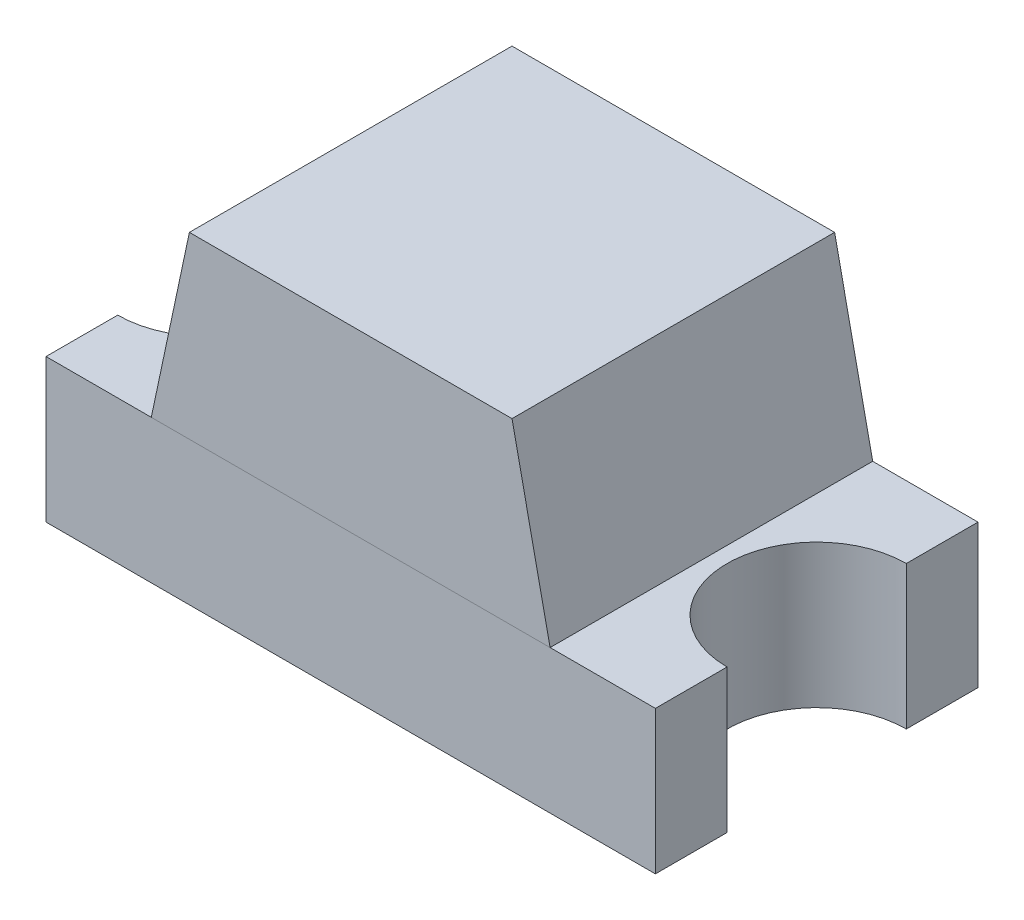
ISO-10303-21;
HEADER;
FILE_DESCRIPTION(('STEP AP214'),'2;1');
FILE_NAME('part.step','',(''),(''),'','','');
FILE_SCHEMA(('AUTOMOTIVE_DESIGN { 1 0 10303 214 1 1 1 1 }'));
ENDSEC;
DATA;
#1=APPLICATION_CONTEXT('core data for automotive mechanical design processes');
#2=APPLICATION_PROTOCOL_DEFINITION('international standard','automotive_design',2000,#1);
#3=PRODUCT_CONTEXT('',#1,'mechanical');
#4=PRODUCT('Part','Part','',(#3));
#5=PRODUCT_RELATED_PRODUCT_CATEGORY('part','',(#4));
#6=PRODUCT_DEFINITION_FORMATION('','',#4);
#7=PRODUCT_DEFINITION_CONTEXT('part definition',#1,'design');
#8=PRODUCT_DEFINITION('design','',#6,#7);
#9=PRODUCT_DEFINITION_SHAPE('','',#8);
#10=(LENGTH_UNIT() NAMED_UNIT(*) SI_UNIT(.MILLI.,.METRE.));
#11=(NAMED_UNIT(*) PLANE_ANGLE_UNIT() SI_UNIT($,.RADIAN.));
#12=(NAMED_UNIT(*) SI_UNIT($,.STERADIAN.) SOLID_ANGLE_UNIT());
#13=UNCERTAINTY_MEASURE_WITH_UNIT(LENGTH_MEASURE(1.E-05),#10,'distance_accuracy_value','');
#14=(GEOMETRIC_REPRESENTATION_CONTEXT(3) GLOBAL_UNCERTAINTY_ASSIGNED_CONTEXT((#13)) GLOBAL_UNIT_ASSIGNED_CONTEXT((#10,
#11,#12)) REPRESENTATION_CONTEXT('',''));
#15=CARTESIAN_POINT('',(0.,0.,0.));
#16=DIRECTION('',(0.,0.,1.));
#17=DIRECTION('',(1.,0.,0.));
#18=AXIS2_PLACEMENT_3D('',#15,#16,#17);
#19=CARTESIAN_POINT('',(-0.45,0.9,0.45));
#20=DIRECTION('',(-0.978147600733806,0.20791169081776,0.));
#21=DIRECTION('',(-0.20791169081776,-0.978147600733806,0.));
#22=AXIS2_PLACEMENT_3D('',#19,#20,#21);
#23=PLANE('',#22);
#24=DIRECTION('',(0.,0.,-1.));
#25=VECTOR('',#24,1.);
#26=CARTESIAN_POINT('',(-0.556278280835011,0.4,-0.45));
#27=LINE('',#26,#25);
#28=CARTESIAN_POINT('',(-0.556278280835011,0.4,-0.45));
#29=VERTEX_POINT('',#28);
#30=CARTESIAN_POINT('',(-0.556278280835011,0.4,0.45));
#31=VERTEX_POINT('',#30);
#32=EDGE_CURVE('E97',#29,#31,#27,.F.);
#33=ORIENTED_EDGE('',*,*,#32,.T.);
#34=DIRECTION('',(0.20791169081776,0.978147600733806,0.));
#35=VECTOR('',#34,1.);
#36=CARTESIAN_POINT('',(-0.45,0.9,0.45));
#37=LINE('',#36,#35);
#38=CARTESIAN_POINT('',(-0.45,0.9,0.45));
#39=VERTEX_POINT('',#38);
#40=EDGE_CURVE('E12',#39,#31,#37,.F.);
#41=ORIENTED_EDGE('',*,*,#40,.F.);
#42=DIRECTION('',(0.,0.,1.));
#43=VECTOR('',#42,1.);
#44=CARTESIAN_POINT('',(-0.45,0.9,0.45));
#45=LINE('',#44,#43);
#46=CARTESIAN_POINT('',(-0.45,0.9,-0.45));
#47=VERTEX_POINT('',#46);
#48=EDGE_CURVE('E98',#47,#39,#45,.T.);
#49=ORIENTED_EDGE('',*,*,#48,.F.);
#50=DIRECTION('',(0.20791169081776,0.978147600733806,0.));
#51=VECTOR('',#50,1.);
#52=CARTESIAN_POINT('',(-0.45,0.9,-0.45));
#53=LINE('',#52,#51);
#54=EDGE_CURVE('E93',#47,#29,#53,.F.);
#55=ORIENTED_EDGE('',*,*,#54,.T.);
#56=EDGE_LOOP('',(#33,#41,#49,#55));
#57=FACE_BOUND('',#56,.T.);
#58=ADVANCED_FACE('F42',(#57),#23,.T.);
#59=CARTESIAN_POINT('',(-0.45,0.9,0.45));
#60=DIRECTION('',(0.,0.,-1.));
#61=DIRECTION('',(-1.,0.,0.));
#62=AXIS2_PLACEMENT_3D('',#59,#60,#61);
#63=PLANE('',#62);
#64=DIRECTION('',(1.,0.,0.));
#65=VECTOR('',#64,1.);
#66=CARTESIAN_POINT('',(-0.45,0.4,0.45));
#67=LINE('',#66,#65);
#68=CARTESIAN_POINT('',(0.556278280835011,0.4,0.45));
#69=VERTEX_POINT('',#68);
#70=EDGE_CURVE('E77',#31,#69,#67,.T.);
#71=ORIENTED_EDGE('',*,*,#70,.T.);
#72=DIRECTION('',(-0.20791169081776,0.978147600733806,0.));
#73=VECTOR('',#72,1.);
#74=CARTESIAN_POINT('',(0.45,0.9,0.45));
#75=LINE('',#74,#73);
#76=CARTESIAN_POINT('',(0.45,0.9,0.45));
#77=VERTEX_POINT('',#76);
#78=EDGE_CURVE('E52',#77,#69,#75,.F.);
#79=ORIENTED_EDGE('',*,*,#78,.F.);
#80=DIRECTION('',(1.,0.,0.));
#81=VECTOR('',#80,1.);
#82=CARTESIAN_POINT('',(-0.45,0.9,0.45));
#83=LINE('',#82,#81);
#84=EDGE_CURVE('E100',#39,#77,#83,.T.);
#85=ORIENTED_EDGE('',*,*,#84,.F.);
#86=ORIENTED_EDGE('',*,*,#40,.T.);
#87=EDGE_LOOP('',(#71,#79,#85,#86));
#88=FACE_BOUND('',#87,.T.);
#89=ADVANCED_FACE('F115',(#88),#63,.F.);
#90=CARTESIAN_POINT('',(0.45,0.9,0.45));
#91=DIRECTION('',(0.978147600733806,0.20791169081776,0.));
#92=DIRECTION('',(-0.20791169081776,0.978147600733806,0.));
#93=AXIS2_PLACEMENT_3D('',#90,#91,#92);
#94=PLANE('',#93);
#95=DIRECTION('',(0.,0.,1.));
#96=VECTOR('',#95,1.);
#97=CARTESIAN_POINT('',(0.556278280835011,0.4,-0.45));
#98=LINE('',#97,#96);
#99=CARTESIAN_POINT('',(0.556278280835011,0.4,-0.45));
#100=VERTEX_POINT('',#99);
#101=EDGE_CURVE('E83',#69,#100,#98,.F.);
#102=ORIENTED_EDGE('',*,*,#101,.T.);
#103=DIRECTION('',(-0.20791169081776,0.978147600733806,0.));
#104=VECTOR('',#103,1.);
#105=CARTESIAN_POINT('',(0.41109545593917,1.08303148938411,-0.45));
#106=LINE('',#105,#104);
#107=CARTESIAN_POINT('',(0.45,0.9,-0.45));
#108=VERTEX_POINT('',#107);
#109=EDGE_CURVE('E46',#108,#100,#106,.F.);
#110=ORIENTED_EDGE('',*,*,#109,.F.);
#111=DIRECTION('',(0.,0.,-1.));
#112=VECTOR('',#111,1.);
#113=CARTESIAN_POINT('',(0.45,0.9,0.45));
#114=LINE('',#113,#112);
#115=EDGE_CURVE('E108',#77,#108,#114,.T.);
#116=ORIENTED_EDGE('',*,*,#115,.F.);
#117=ORIENTED_EDGE('',*,*,#78,.T.);
#118=EDGE_LOOP('',(#102,#110,#116,#117));
#119=FACE_BOUND('',#118,.T.);
#120=ADVANCED_FACE('F44',(#119),#94,.T.);
#121=CARTESIAN_POINT('',(-0.45,0.9,-0.45));
#122=DIRECTION('',(0.,0.,1.));
#123=DIRECTION('',(1.,0.,0.));
#124=AXIS2_PLACEMENT_3D('',#121,#122,#123);
#125=PLANE('',#124);
#126=DIRECTION('',(-1.,0.,0.));
#127=VECTOR('',#126,1.);
#128=CARTESIAN_POINT('',(-0.45,0.4,-0.45));
#129=LINE('',#128,#127);
#130=EDGE_CURVE('E88',#100,#29,#129,.T.);
#131=ORIENTED_EDGE('',*,*,#130,.T.);
#132=ORIENTED_EDGE('',*,*,#54,.F.);
#133=DIRECTION('',(-1.,0.,0.));
#134=VECTOR('',#133,1.);
#135=CARTESIAN_POINT('',(-0.45,0.9,-0.45));
#136=LINE('',#135,#134);
#137=EDGE_CURVE('E61',#108,#47,#136,.T.);
#138=ORIENTED_EDGE('',*,*,#137,.F.);
#139=ORIENTED_EDGE('',*,*,#109,.T.);
#140=EDGE_LOOP('',(#131,#132,#138,#139));
#141=FACE_BOUND('',#140,.T.);
#142=ADVANCED_FACE('F91',(#141),#125,.F.);
#143=CARTESIAN_POINT('',(-0.45,0.9,-0.45));
#144=DIRECTION('',(0.,-1.,0.));
#145=DIRECTION('',(0.,0.,-1.));
#146=AXIS2_PLACEMENT_3D('',#143,#144,#145);
#147=PLANE('',#146);
#148=ORIENTED_EDGE('',*,*,#48,.T.);
#149=ORIENTED_EDGE('',*,*,#84,.T.);
#150=ORIENTED_EDGE('',*,*,#115,.T.);
#151=ORIENTED_EDGE('',*,*,#137,.T.);
#152=EDGE_LOOP('',(#148,#149,#150,#151));
#153=FACE_BOUND('',#152,.T.);
#154=ADVANCED_FACE('F113',(#153),#147,.F.);
#155=CARTESIAN_POINT('',(-0.45,0.4,-0.45));
#156=DIRECTION('',(0.,-1.,0.));
#157=DIRECTION('',(0.,0.,-1.));
#158=AXIS2_PLACEMENT_3D('',#155,#156,#157);
#159=PLANE('',#158);
#160=ORIENTED_EDGE('',*,*,#32,.F.);
#161=ORIENTED_EDGE('',*,*,#130,.F.);
#162=ORIENTED_EDGE('',*,*,#101,.F.);
#163=ORIENTED_EDGE('',*,*,#70,.F.);
#164=EDGE_LOOP('',(#160,#161,#162,#163));
#165=FACE_BOUND('',#164,.T.);
#166=ADVANCED_FACE('F95',(#165),#159,.T.);
#167=CLOSED_SHELL('',(#58,#89,#120,#142,#154,#166));
#168=MANIFOLD_SOLID_BREP('B2',#167);
#169=CARTESIAN_POINT('',(0.85,0.4,0.));
#170=DIRECTION('',(0.,-1.,0.));
#171=DIRECTION('',(0.,0.,-1.));
#172=AXIS2_PLACEMENT_3D('',#169,#170,#171);
#173=CYLINDRICAL_SURFACE('',#172,0.25);
#174=CARTESIAN_POINT('',(0.85,0.,0.));
#175=DIRECTION('',(0.,-1.,0.));
#176=DIRECTION('',(0.,0.,1.));
#177=AXIS2_PLACEMENT_3D('',#174,#175,#176);
#178=CIRCLE('',#177,0.25);
#179=CARTESIAN_POINT('',(0.85,0.,0.25));
#180=VERTEX_POINT('',#179);
#181=CARTESIAN_POINT('',(0.85,0.,-0.25));
#182=VERTEX_POINT('',#181);
#183=EDGE_CURVE('E261',#180,#182,#178,.T.);
#184=ORIENTED_EDGE('',*,*,#183,.T.);
#185=DIRECTION('',(0.,-1.,0.));
#186=VECTOR('',#185,1.);
#187=CARTESIAN_POINT('',(0.85,0.4,-0.25));
#188=LINE('',#187,#186);
#189=CARTESIAN_POINT('',(0.85,0.4,-0.25));
#190=VERTEX_POINT('',#189);
#191=EDGE_CURVE('E40',#190,#182,#188,.T.);
#192=ORIENTED_EDGE('',*,*,#191,.F.);
#193=CARTESIAN_POINT('',(0.85,0.4,0.));
#194=DIRECTION('',(0.,-1.,0.));
#195=DIRECTION('',(0.,0.,1.));
#196=AXIS2_PLACEMENT_3D('',#193,#194,#195);
#197=CIRCLE('',#196,0.25);
#198=CARTESIAN_POINT('',(0.85,0.4,0.25));
#199=VERTEX_POINT('',#198);
#200=EDGE_CURVE('E275',#199,#190,#197,.T.);
#201=ORIENTED_EDGE('',*,*,#200,.F.);
#202=DIRECTION('',(0.,-1.,0.));
#203=VECTOR('',#202,1.);
#204=CARTESIAN_POINT('',(0.85,0.4,0.25));
#205=LINE('',#204,#203);
#206=EDGE_CURVE('E257',#199,#180,#205,.T.);
#207=ORIENTED_EDGE('',*,*,#206,.T.);
#208=EDGE_LOOP('',(#184,#192,#201,#207));
#209=FACE_BOUND('',#208,.T.);
#210=ADVANCED_FACE('F165',(#209),#173,.F.);
#211=CARTESIAN_POINT('',(0.85,0.4,-0.25));
#212=DIRECTION('',(-1.,0.,0.));
#213=DIRECTION('',(0.,0.,1.));
#214=AXIS2_PLACEMENT_3D('',#211,#212,#213);
#215=PLANE('',#214);
#216=DIRECTION('',(0.,0.,-1.));
#217=VECTOR('',#216,1.);
#218=CARTESIAN_POINT('',(0.85,0.,-0.25));
#219=LINE('',#218,#217);
#220=CARTESIAN_POINT('',(0.85,0.,-0.45));
#221=VERTEX_POINT('',#220);
#222=EDGE_CURVE('E264',#182,#221,#219,.T.);
#223=ORIENTED_EDGE('',*,*,#222,.T.);
#224=DIRECTION('',(0.,-1.,0.));
#225=VECTOR('',#224,1.);
#226=CARTESIAN_POINT('',(0.85,0.4,-0.45));
#227=LINE('',#226,#225);
#228=CARTESIAN_POINT('',(0.85,0.4,-0.45));
#229=VERTEX_POINT('',#228);
#230=EDGE_CURVE('E173',#229,#221,#227,.T.);
#231=ORIENTED_EDGE('',*,*,#230,.F.);
#232=DIRECTION('',(0.,0.,-1.));
#233=VECTOR('',#232,1.);
#234=CARTESIAN_POINT('',(0.85,0.4,-0.25));
#235=LINE('',#234,#233);
#236=EDGE_CURVE('E224',#190,#229,#235,.T.);
#237=ORIENTED_EDGE('',*,*,#236,.F.);
#238=ORIENTED_EDGE('',*,*,#191,.T.);
#239=EDGE_LOOP('',(#223,#231,#237,#238));
#240=FACE_BOUND('',#239,.T.);
#241=ADVANCED_FACE('F310',(#240),#215,.F.);
#242=CARTESIAN_POINT('',(-0.85,0.4,-0.45));
#243=DIRECTION('',(0.,0.,1.));
#244=DIRECTION('',(1.,0.,0.));
#245=AXIS2_PLACEMENT_3D('',#242,#243,#244);
#246=PLANE('',#245);
#247=DIRECTION('',(-1.,0.,0.));
#248=VECTOR('',#247,1.);
#249=CARTESIAN_POINT('',(-0.85,0.,-0.45));
#250=LINE('',#249,#248);
#251=CARTESIAN_POINT('',(-0.85,0.,-0.45));
#252=VERTEX_POINT('',#251);
#253=EDGE_CURVE('E266',#221,#252,#250,.T.);
#254=ORIENTED_EDGE('',*,*,#253,.T.);
#255=DIRECTION('',(0.,-1.,0.));
#256=VECTOR('',#255,1.);
#257=CARTESIAN_POINT('',(-0.85,0.4,-0.45));
#258=LINE('',#257,#256);
#259=CARTESIAN_POINT('',(-0.85,0.4,-0.45));
#260=VERTEX_POINT('',#259);
#261=EDGE_CURVE('E282',#260,#252,#258,.T.);
#262=ORIENTED_EDGE('',*,*,#261,.F.);
#263=DIRECTION('',(-1.,0.,0.));
#264=VECTOR('',#263,1.);
#265=CARTESIAN_POINT('',(-0.85,0.4,-0.45));
#266=LINE('',#265,#264);
#267=EDGE_CURVE('E290',#229,#260,#266,.T.);
#268=ORIENTED_EDGE('',*,*,#267,.F.);
#269=ORIENTED_EDGE('',*,*,#230,.T.);
#270=EDGE_LOOP('',(#254,#262,#268,#269));
#271=FACE_BOUND('',#270,.T.);
#272=ADVANCED_FACE('F288',(#271),#246,.F.);
#273=CARTESIAN_POINT('',(-0.85,0.4,-0.25));
#274=DIRECTION('',(1.,0.,0.));
#275=DIRECTION('',(0.,0.,-1.));
#276=AXIS2_PLACEMENT_3D('',#273,#274,#275);
#277=PLANE('',#276);
#278=DIRECTION('',(0.,0.,1.));
#279=VECTOR('',#278,1.);
#280=CARTESIAN_POINT('',(-0.85,0.,-0.25));
#281=LINE('',#280,#279);
#282=CARTESIAN_POINT('',(-0.85,0.,-0.25));
#283=VERTEX_POINT('',#282);
#284=EDGE_CURVE('E268',#252,#283,#281,.T.);
#285=ORIENTED_EDGE('',*,*,#284,.T.);
#286=DIRECTION('',(0.,-1.,0.));
#287=VECTOR('',#286,1.);
#288=CARTESIAN_POINT('',(-0.85,0.4,-0.25));
#289=LINE('',#288,#287);
#290=CARTESIAN_POINT('',(-0.85,0.4,-0.25));
#291=VERTEX_POINT('',#290);
#292=EDGE_CURVE('E279',#291,#283,#289,.T.);
#293=ORIENTED_EDGE('',*,*,#292,.F.);
#294=DIRECTION('',(0.,0.,1.));
#295=VECTOR('',#294,1.);
#296=CARTESIAN_POINT('',(-0.85,0.4,-0.25));
#297=LINE('',#296,#295);
#298=EDGE_CURVE('E302',#260,#291,#297,.T.);
#299=ORIENTED_EDGE('',*,*,#298,.F.);
#300=ORIENTED_EDGE('',*,*,#261,.T.);
#301=EDGE_LOOP('',(#285,#293,#299,#300));
#302=FACE_BOUND('',#301,.T.);
#303=ADVANCED_FACE('F298',(#302),#277,.F.);
#304=CARTESIAN_POINT('',(-0.85,0.4,0.));
#305=DIRECTION('',(0.,-1.,0.));
#306=DIRECTION('',(0.,0.,-1.));
#307=AXIS2_PLACEMENT_3D('',#304,#305,#306);
#308=CYLINDRICAL_SURFACE('',#307,0.25);
#309=CARTESIAN_POINT('',(-0.85,0.,0.));
#310=DIRECTION('',(0.,-1.,0.));
#311=DIRECTION('',(0.,0.,1.));
#312=AXIS2_PLACEMENT_3D('',#309,#310,#311);
#313=CIRCLE('',#312,0.25);
#314=CARTESIAN_POINT('',(-0.85,0.,0.25));
#315=VERTEX_POINT('',#314);
#316=EDGE_CURVE('E270',#283,#315,#313,.T.);
#317=ORIENTED_EDGE('',*,*,#316,.T.);
#318=DIRECTION('',(0.,-1.,0.));
#319=VECTOR('',#318,1.);
#320=CARTESIAN_POINT('',(-0.85,0.4,0.25));
#321=LINE('',#320,#319);
#322=CARTESIAN_POINT('',(-0.85,0.4,0.25));
#323=VERTEX_POINT('',#322);
#324=EDGE_CURVE('E252',#323,#315,#321,.T.);
#325=ORIENTED_EDGE('',*,*,#324,.F.);
#326=CARTESIAN_POINT('',(-0.85,0.4,0.));
#327=DIRECTION('',(0.,-1.,0.));
#328=DIRECTION('',(0.,0.,1.));
#329=AXIS2_PLACEMENT_3D('',#326,#327,#328);
#330=CIRCLE('',#329,0.25);
#331=EDGE_CURVE('E243',#291,#323,#330,.T.);
#332=ORIENTED_EDGE('',*,*,#331,.F.);
#333=ORIENTED_EDGE('',*,*,#292,.T.);
#334=EDGE_LOOP('',(#317,#325,#332,#333));
#335=FACE_BOUND('',#334,.T.);
#336=ADVANCED_FACE('F301',(#335),#308,.F.);
#337=CARTESIAN_POINT('',(-0.85,0.4,0.45));
#338=DIRECTION('',(1.,0.,0.));
#339=DIRECTION('',(0.,0.,-1.));
#340=AXIS2_PLACEMENT_3D('',#337,#338,#339);
#341=PLANE('',#340);
#342=DIRECTION('',(0.,0.,1.));
#343=VECTOR('',#342,1.);
#344=CARTESIAN_POINT('',(-0.85,0.,0.45));
#345=LINE('',#344,#343);
#346=CARTESIAN_POINT('',(-0.85,0.,0.45));
#347=VERTEX_POINT('',#346);
#348=EDGE_CURVE('E251',#315,#347,#345,.T.);
#349=ORIENTED_EDGE('',*,*,#348,.T.);
#350=DIRECTION('',(0.,-1.,0.));
#351=VECTOR('',#350,1.);
#352=CARTESIAN_POINT('',(-0.85,0.4,0.45));
#353=LINE('',#352,#351);
#354=CARTESIAN_POINT('',(-0.85,0.4,0.45));
#355=VERTEX_POINT('',#354);
#356=EDGE_CURVE('E248',#355,#347,#353,.T.);
#357=ORIENTED_EDGE('',*,*,#356,.F.);
#358=DIRECTION('',(0.,0.,1.));
#359=VECTOR('',#358,1.);
#360=CARTESIAN_POINT('',(-0.85,0.4,0.45));
#361=LINE('',#360,#359);
#362=EDGE_CURVE('E237',#323,#355,#361,.T.);
#363=ORIENTED_EDGE('',*,*,#362,.F.);
#364=ORIENTED_EDGE('',*,*,#324,.T.);
#365=EDGE_LOOP('',(#349,#357,#363,#364));
#366=FACE_BOUND('',#365,.T.);
#367=ADVANCED_FACE('F249',(#366),#341,.F.);
#368=CARTESIAN_POINT('',(-0.85,0.4,0.45));
#369=DIRECTION('',(0.,0.,-1.));
#370=DIRECTION('',(-1.,0.,0.));
#371=AXIS2_PLACEMENT_3D('',#368,#369,#370);
#372=PLANE('',#371);
#373=DIRECTION('',(1.,0.,0.));
#374=VECTOR('',#373,1.);
#375=CARTESIAN_POINT('',(-0.85,0.,0.45));
#376=LINE('',#375,#374);
#377=CARTESIAN_POINT('',(0.85,0.,0.45));
#378=VERTEX_POINT('',#377);
#379=EDGE_CURVE('E210',#347,#378,#376,.T.);
#380=ORIENTED_EDGE('',*,*,#379,.T.);
#381=DIRECTION('',(0.,-1.,0.));
#382=VECTOR('',#381,1.);
#383=CARTESIAN_POINT('',(0.85,0.4,0.45));
#384=LINE('',#383,#382);
#385=CARTESIAN_POINT('',(0.85,0.4,0.45));
#386=VERTEX_POINT('',#385);
#387=EDGE_CURVE('E253',#386,#378,#384,.T.);
#388=ORIENTED_EDGE('',*,*,#387,.F.);
#389=DIRECTION('',(1.,0.,0.));
#390=VECTOR('',#389,1.);
#391=CARTESIAN_POINT('',(-0.85,0.4,0.45));
#392=LINE('',#391,#390);
#393=EDGE_CURVE('E241',#355,#386,#392,.T.);
#394=ORIENTED_EDGE('',*,*,#393,.F.);
#395=ORIENTED_EDGE('',*,*,#356,.T.);
#396=EDGE_LOOP('',(#380,#388,#394,#395));
#397=FACE_BOUND('',#396,.T.);
#398=ADVANCED_FACE('F255',(#397),#372,.F.);
#399=CARTESIAN_POINT('',(0.85,0.4,0.45));
#400=DIRECTION('',(-1.,0.,0.));
#401=DIRECTION('',(0.,0.,1.));
#402=AXIS2_PLACEMENT_3D('',#399,#400,#401);
#403=PLANE('',#402);
#404=DIRECTION('',(0.,0.,-1.));
#405=VECTOR('',#404,1.);
#406=CARTESIAN_POINT('',(0.85,0.,0.45));
#407=LINE('',#406,#405);
#408=EDGE_CURVE('E216',#378,#180,#407,.T.);
#409=ORIENTED_EDGE('',*,*,#408,.T.);
#410=ORIENTED_EDGE('',*,*,#206,.F.);
#411=DIRECTION('',(0.,0.,-1.));
#412=VECTOR('',#411,1.);
#413=CARTESIAN_POINT('',(0.85,0.4,0.45));
#414=LINE('',#413,#412);
#415=EDGE_CURVE('E181',#386,#199,#414,.T.);
#416=ORIENTED_EDGE('',*,*,#415,.F.);
#417=ORIENTED_EDGE('',*,*,#387,.T.);
#418=EDGE_LOOP('',(#409,#410,#416,#417));
#419=FACE_BOUND('',#418,.T.);
#420=ADVANCED_FACE('F326',(#419),#403,.F.);
#421=CARTESIAN_POINT('',(0.85,0.4,0.));
#422=DIRECTION('',(0.,1.,0.));
#423=DIRECTION('',(0.,0.,1.));
#424=AXIS2_PLACEMENT_3D('',#421,#422,#423);
#425=PLANE('',#424);
#426=ORIENTED_EDGE('',*,*,#200,.T.);
#427=ORIENTED_EDGE('',*,*,#236,.T.);
#428=ORIENTED_EDGE('',*,*,#267,.T.);
#429=ORIENTED_EDGE('',*,*,#298,.T.);
#430=ORIENTED_EDGE('',*,*,#331,.T.);
#431=ORIENTED_EDGE('',*,*,#362,.T.);
#432=ORIENTED_EDGE('',*,*,#393,.T.);
#433=ORIENTED_EDGE('',*,*,#415,.T.);
#434=EDGE_LOOP('',(#426,#427,#428,#429,#430,#431,#432,#433));
#435=FACE_BOUND('',#434,.T.);
#436=ADVANCED_FACE('F239',(#435),#425,.T.);
#437=CARTESIAN_POINT('',(0.85,0.,0.));
#438=DIRECTION('',(0.,1.,0.));
#439=DIRECTION('',(0.,0.,1.));
#440=AXIS2_PLACEMENT_3D('',#437,#438,#439);
#441=PLANE('',#440);
#442=ORIENTED_EDGE('',*,*,#183,.F.);
#443=ORIENTED_EDGE('',*,*,#408,.F.);
#444=ORIENTED_EDGE('',*,*,#379,.F.);
#445=ORIENTED_EDGE('',*,*,#348,.F.);
#446=ORIENTED_EDGE('',*,*,#316,.F.);
#447=ORIENTED_EDGE('',*,*,#284,.F.);
#448=ORIENTED_EDGE('',*,*,#253,.F.);
#449=ORIENTED_EDGE('',*,*,#222,.F.);
#450=EDGE_LOOP('',(#442,#443,#444,#445,#446,#447,#448,#449));
#451=FACE_BOUND('',#450,.T.);
#452=ADVANCED_FACE('F294',(#451),#441,.F.);
#453=CLOSED_SHELL('',(#210,#241,#272,#303,#336,#367,#398,#420,#436,#452));
#454=MANIFOLD_SOLID_BREP('B6',#453);
#455=ADVANCED_BREP_SHAPE_REPRESENTATION('',(#18,#168,#454),#14);
#456=SHAPE_DEFINITION_REPRESENTATION(#9,#455);
ENDSEC;
END-ISO-10303-21;
